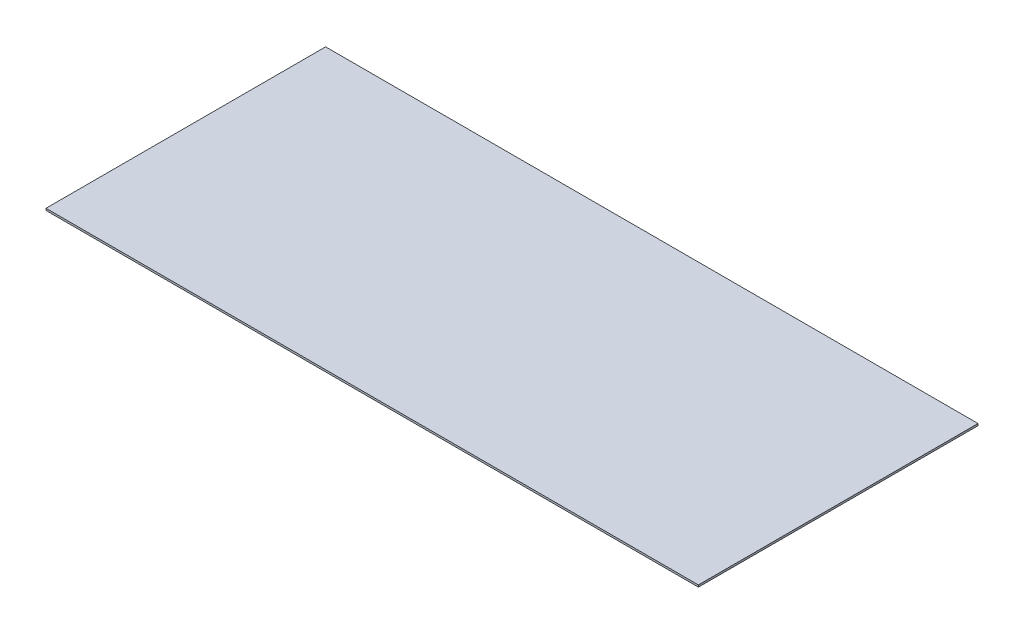
ISO-10303-21;
HEADER;
FILE_DESCRIPTION(('STEP AP214'),'2;1');
FILE_NAME('part.step','',(''),(''),'','','');
FILE_SCHEMA(('AUTOMOTIVE_DESIGN { 1 0 10303 214 1 1 1 1 }'));
ENDSEC;
DATA;
#1=APPLICATION_CONTEXT('core data for automotive mechanical design processes');
#2=APPLICATION_PROTOCOL_DEFINITION('international standard','automotive_design',2000,#1);
#3=PRODUCT_CONTEXT('',#1,'mechanical');
#4=PRODUCT('Part','Part','',(#3));
#5=PRODUCT_RELATED_PRODUCT_CATEGORY('part','',(#4));
#6=PRODUCT_DEFINITION_FORMATION('','',#4);
#7=PRODUCT_DEFINITION_CONTEXT('part definition',#1,'design');
#8=PRODUCT_DEFINITION('design','',#6,#7);
#9=PRODUCT_DEFINITION_SHAPE('','',#8);
#10=(LENGTH_UNIT() NAMED_UNIT(*) SI_UNIT(.MILLI.,.METRE.));
#11=(NAMED_UNIT(*) PLANE_ANGLE_UNIT() SI_UNIT($,.RADIAN.));
#12=(NAMED_UNIT(*) SI_UNIT($,.STERADIAN.) SOLID_ANGLE_UNIT());
#13=UNCERTAINTY_MEASURE_WITH_UNIT(LENGTH_MEASURE(1.E-05),#10,'distance_accuracy_value','');
#14=(GEOMETRIC_REPRESENTATION_CONTEXT(3) GLOBAL_UNCERTAINTY_ASSIGNED_CONTEXT((#13)) GLOBAL_UNIT_ASSIGNED_CONTEXT((#10,
#11,#12)) REPRESENTATION_CONTEXT('',''));
#15=CARTESIAN_POINT('',(0.,0.,0.));
#16=DIRECTION('',(0.,0.,1.));
#17=DIRECTION('',(1.,0.,0.));
#18=AXIS2_PLACEMENT_3D('',#15,#16,#17);
#19=CARTESIAN_POINT('',(-1066.8,6.35,457.2));
#20=DIRECTION('',(1.,0.,0.));
#21=DIRECTION('',(0.,0.,-1.));
#22=AXIS2_PLACEMENT_3D('',#19,#20,#21);
#23=PLANE('',#22);
#24=DIRECTION('',(0.,0.,1.));
#25=VECTOR('',#24,1.);
#26=CARTESIAN_POINT('',(-1066.8,0.,457.2));
#27=LINE('',#26,#25);
#28=CARTESIAN_POINT('',(-1066.8,0.,-457.2));
#29=VERTEX_POINT('',#28);
#30=CARTESIAN_POINT('',(-1066.8,0.,457.2));
#31=VERTEX_POINT('',#30);
#32=EDGE_CURVE('E96',#29,#31,#27,.T.);
#33=ORIENTED_EDGE('',*,*,#32,.T.);
#34=DIRECTION('',(0.,-1.,0.));
#35=VECTOR('',#34,1.);
#36=CARTESIAN_POINT('',(-1066.8,6.35,457.2));
#37=LINE('',#36,#35);
#38=CARTESIAN_POINT('',(-1066.8,6.35,457.2));
#39=VERTEX_POINT('',#38);
#40=EDGE_CURVE('E11',#39,#31,#37,.T.);
#41=ORIENTED_EDGE('',*,*,#40,.F.);
#42=DIRECTION('',(0.,0.,1.));
#43=VECTOR('',#42,1.);
#44=CARTESIAN_POINT('',(-1066.8,6.35,457.2));
#45=LINE('',#44,#43);
#46=CARTESIAN_POINT('',(-1066.8,6.35,-457.2));
#47=VERTEX_POINT('',#46);
#48=EDGE_CURVE('E84',#47,#39,#45,.T.);
#49=ORIENTED_EDGE('',*,*,#48,.F.);
#50=DIRECTION('',(0.,-1.,0.));
#51=VECTOR('',#50,1.);
#52=CARTESIAN_POINT('',(-1066.8,6.35,-457.2));
#53=LINE('',#52,#51);
#54=EDGE_CURVE('E92',#47,#29,#53,.T.);
#55=ORIENTED_EDGE('',*,*,#54,.T.);
#56=EDGE_LOOP('',(#33,#41,#49,#55));
#57=FACE_BOUND('',#56,.T.);
#58=ADVANCED_FACE('F33',(#57),#23,.F.);
#59=CARTESIAN_POINT('',(1066.8,6.35,457.2));
#60=DIRECTION('',(0.,0.,-1.));
#61=DIRECTION('',(-1.,0.,0.));
#62=AXIS2_PLACEMENT_3D('',#59,#60,#61);
#63=PLANE('',#62);
#64=DIRECTION('',(1.,0.,0.));
#65=VECTOR('',#64,1.);
#66=CARTESIAN_POINT('',(1066.8,0.,457.2));
#67=LINE('',#66,#65);
#68=CARTESIAN_POINT('',(1066.8,0.,457.2));
#69=VERTEX_POINT('',#68);
#70=EDGE_CURVE('E88',#31,#69,#67,.T.);
#71=ORIENTED_EDGE('',*,*,#70,.T.);
#72=DIRECTION('',(0.,-1.,0.));
#73=VECTOR('',#72,1.);
#74=CARTESIAN_POINT('',(1066.8,6.35,457.2));
#75=LINE('',#74,#73);
#76=CARTESIAN_POINT('',(1066.8,6.35,457.2));
#77=VERTEX_POINT('',#76);
#78=EDGE_CURVE('E41',#77,#69,#75,.T.);
#79=ORIENTED_EDGE('',*,*,#78,.F.);
#80=DIRECTION('',(1.,0.,0.));
#81=VECTOR('',#80,1.);
#82=CARTESIAN_POINT('',(1066.8,6.35,457.2));
#83=LINE('',#82,#81);
#84=EDGE_CURVE('E79',#39,#77,#83,.T.);
#85=ORIENTED_EDGE('',*,*,#84,.F.);
#86=ORIENTED_EDGE('',*,*,#40,.T.);
#87=EDGE_LOOP('',(#71,#79,#85,#86));
#88=FACE_BOUND('',#87,.T.);
#89=ADVANCED_FACE('F87',(#88),#63,.F.);
#90=CARTESIAN_POINT('',(1066.8,6.35,457.2));
#91=DIRECTION('',(-1.,0.,0.));
#92=DIRECTION('',(0.,0.,1.));
#93=AXIS2_PLACEMENT_3D('',#90,#91,#92);
#94=PLANE('',#93);
#95=DIRECTION('',(0.,0.,-1.));
#96=VECTOR('',#95,1.);
#97=CARTESIAN_POINT('',(1066.8,0.,457.2));
#98=LINE('',#97,#96);
#99=CARTESIAN_POINT('',(1066.8,0.,-457.2));
#100=VERTEX_POINT('',#99);
#101=EDGE_CURVE('E66',#69,#100,#98,.T.);
#102=ORIENTED_EDGE('',*,*,#101,.T.);
#103=DIRECTION('',(0.,-1.,0.));
#104=VECTOR('',#103,1.);
#105=CARTESIAN_POINT('',(1066.8,6.35,-457.2));
#106=LINE('',#105,#104);
#107=CARTESIAN_POINT('',(1066.8,6.35,-457.2));
#108=VERTEX_POINT('',#107);
#109=EDGE_CURVE('E89',#108,#100,#106,.T.);
#110=ORIENTED_EDGE('',*,*,#109,.F.);
#111=DIRECTION('',(0.,0.,-1.));
#112=VECTOR('',#111,1.);
#113=CARTESIAN_POINT('',(1066.8,6.35,457.2));
#114=LINE('',#113,#112);
#115=EDGE_CURVE('E82',#77,#108,#114,.T.);
#116=ORIENTED_EDGE('',*,*,#115,.F.);
#117=ORIENTED_EDGE('',*,*,#78,.T.);
#118=EDGE_LOOP('',(#102,#110,#116,#117));
#119=FACE_BOUND('',#118,.T.);
#120=ADVANCED_FACE('F90',(#119),#94,.F.);
#121=CARTESIAN_POINT('',(1066.8,6.35,-457.2));
#122=DIRECTION('',(0.,0.,1.));
#123=DIRECTION('',(1.,0.,0.));
#124=AXIS2_PLACEMENT_3D('',#121,#122,#123);
#125=PLANE('',#124);
#126=DIRECTION('',(-1.,0.,0.));
#127=VECTOR('',#126,1.);
#128=CARTESIAN_POINT('',(1066.8,0.,-457.2));
#129=LINE('',#128,#127);
#130=EDGE_CURVE('E72',#100,#29,#129,.T.);
#131=ORIENTED_EDGE('',*,*,#130,.T.);
#132=ORIENTED_EDGE('',*,*,#54,.F.);
#133=DIRECTION('',(-1.,0.,0.));
#134=VECTOR('',#133,1.);
#135=CARTESIAN_POINT('',(1066.8,6.35,-457.2));
#136=LINE('',#135,#134);
#137=EDGE_CURVE('E49',#108,#47,#136,.T.);
#138=ORIENTED_EDGE('',*,*,#137,.F.);
#139=ORIENTED_EDGE('',*,*,#109,.T.);
#140=EDGE_LOOP('',(#131,#132,#138,#139));
#141=FACE_BOUND('',#140,.T.);
#142=ADVANCED_FACE('F103',(#141),#125,.F.);
#143=CARTESIAN_POINT('',(0.,6.35,0.));
#144=DIRECTION('',(0.,1.,0.));
#145=DIRECTION('',(0.,0.,1.));
#146=AXIS2_PLACEMENT_3D('',#143,#144,#145);
#147=PLANE('',#146);
#148=ORIENTED_EDGE('',*,*,#48,.T.);
#149=ORIENTED_EDGE('',*,*,#84,.T.);
#150=ORIENTED_EDGE('',*,*,#115,.T.);
#151=ORIENTED_EDGE('',*,*,#137,.T.);
#152=EDGE_LOOP('',(#148,#149,#150,#151));
#153=FACE_BOUND('',#152,.T.);
#154=ADVANCED_FACE('F80',(#153),#147,.T.);
#155=CARTESIAN_POINT('',(0.,0.,0.));
#156=DIRECTION('',(0.,1.,0.));
#157=DIRECTION('',(0.,0.,1.));
#158=AXIS2_PLACEMENT_3D('',#155,#156,#157);
#159=PLANE('',#158);
#160=ORIENTED_EDGE('',*,*,#32,.F.);
#161=ORIENTED_EDGE('',*,*,#130,.F.);
#162=ORIENTED_EDGE('',*,*,#101,.F.);
#163=ORIENTED_EDGE('',*,*,#70,.F.);
#164=EDGE_LOOP('',(#160,#161,#162,#163));
#165=FACE_BOUND('',#164,.T.);
#166=ADVANCED_FACE('F106',(#165),#159,.F.);
#167=CLOSED_SHELL('',(#58,#89,#120,#142,#154,#166));
#168=MANIFOLD_SOLID_BREP('B2',#167);
#169=ADVANCED_BREP_SHAPE_REPRESENTATION('',(#18,#168),#14);
#170=SHAPE_DEFINITION_REPRESENTATION(#9,#169);
ENDSEC;
END-ISO-10303-21;
